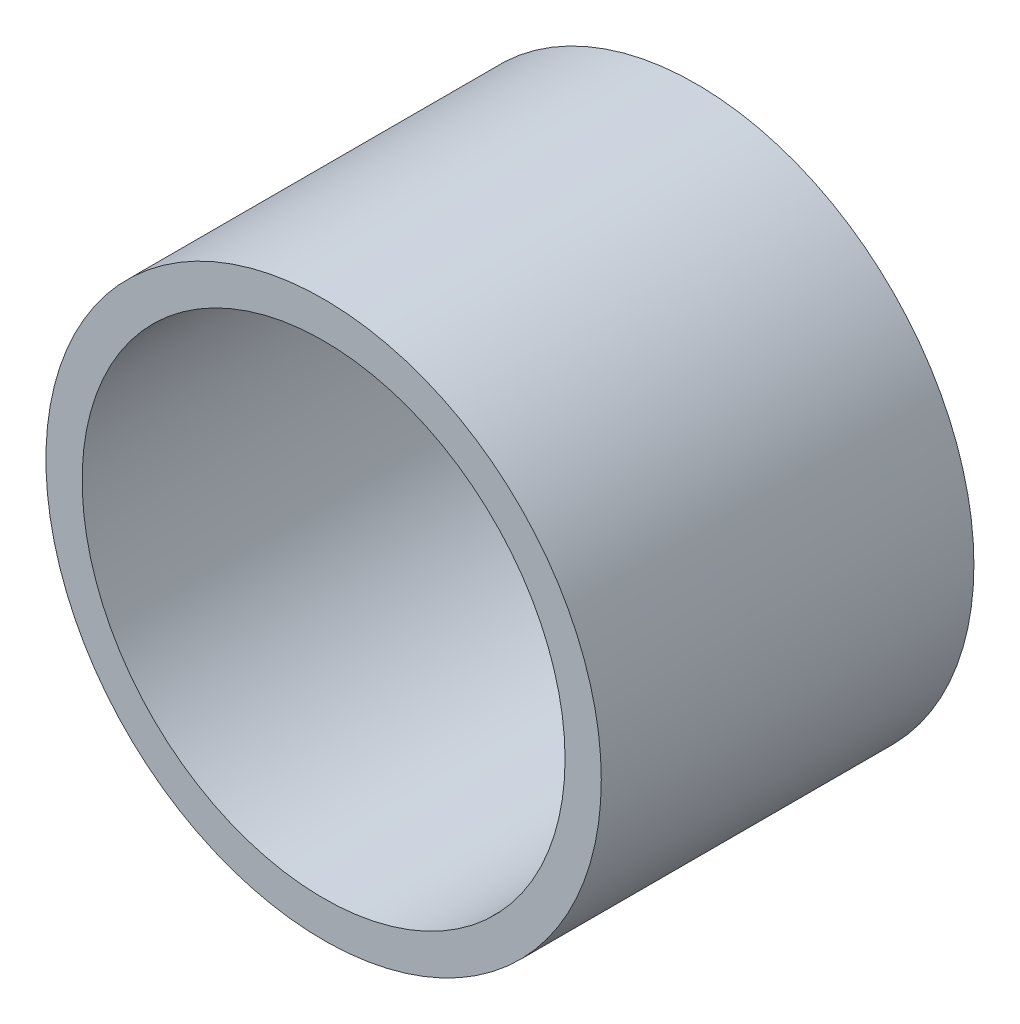
ISO-10303-21;
HEADER;
FILE_DESCRIPTION(('STEP AP214'),'2;1');
FILE_NAME('part.step','',(''),(''),'','','');
FILE_SCHEMA(('AUTOMOTIVE_DESIGN { 1 0 10303 214 1 1 1 1 }'));
ENDSEC;
DATA;
#1=APPLICATION_CONTEXT('core data for automotive mechanical design processes');
#2=APPLICATION_PROTOCOL_DEFINITION('international standard','automotive_design',2000,#1);
#3=PRODUCT_CONTEXT('',#1,'mechanical');
#4=PRODUCT('Part','Part','',(#3));
#5=PRODUCT_RELATED_PRODUCT_CATEGORY('part','',(#4));
#6=PRODUCT_DEFINITION_FORMATION('','',#4);
#7=PRODUCT_DEFINITION_CONTEXT('part definition',#1,'design');
#8=PRODUCT_DEFINITION('design','',#6,#7);
#9=PRODUCT_DEFINITION_SHAPE('','',#8);
#10=(LENGTH_UNIT() NAMED_UNIT(*) SI_UNIT(.MILLI.,.METRE.));
#11=(NAMED_UNIT(*) PLANE_ANGLE_UNIT() SI_UNIT($,.RADIAN.));
#12=(NAMED_UNIT(*) SI_UNIT($,.STERADIAN.) SOLID_ANGLE_UNIT());
#13=UNCERTAINTY_MEASURE_WITH_UNIT(LENGTH_MEASURE(1.E-05),#10,'distance_accuracy_value','');
#14=(GEOMETRIC_REPRESENTATION_CONTEXT(3) GLOBAL_UNCERTAINTY_ASSIGNED_CONTEXT((#13)) GLOBAL_UNIT_ASSIGNED_CONTEXT((#10,
#11,#12)) REPRESENTATION_CONTEXT('',''));
#15=CARTESIAN_POINT('',(0.,0.,0.));
#16=DIRECTION('',(0.,0.,1.));
#17=DIRECTION('',(1.,0.,0.));
#18=AXIS2_PLACEMENT_3D('',#15,#16,#17);
#19=CARTESIAN_POINT('',(0.,0.,67.9));
#20=DIRECTION('',(0.,0.,1.));
#21=DIRECTION('',(1.,0.,0.));
#22=AXIS2_PLACEMENT_3D('',#19,#20,#21);
#23=PLANE('',#22);
#24=CARTESIAN_POINT('',(0.,0.,67.9));
#25=DIRECTION('',(0.,0.,1.));
#26=DIRECTION('',(1.,0.,0.));
#27=AXIS2_PLACEMENT_3D('',#24,#25,#26);
#28=CIRCLE('',#27,50.6);
#29=CARTESIAN_POINT('',(50.6,0.,67.9));
#30=VERTEX_POINT('',#29);
#31=EDGE_CURVE('E10',#30,#30,#28,.T.);
#32=ORIENTED_EDGE('',*,*,#31,.T.);
#33=EDGE_LOOP('',(#32));
#34=FACE_BOUND('',#33,.T.);
#35=CARTESIAN_POINT('',(0.,0.,67.9));
#36=DIRECTION('',(0.,0.,1.));
#37=DIRECTION('',(1.,0.,0.));
#38=AXIS2_PLACEMENT_3D('',#35,#36,#37);
#39=CIRCLE('',#38,44.);
#40=CARTESIAN_POINT('',(44.,0.,67.9));
#41=VERTEX_POINT('',#40);
#42=EDGE_CURVE('E42',#41,#41,#39,.T.);
#43=ORIENTED_EDGE('',*,*,#42,.F.);
#44=EDGE_LOOP('',(#43));
#45=FACE_BOUND('',#44,.T.);
#46=ADVANCED_FACE('F31',(#34,#45),#23,.T.);
#47=CARTESIAN_POINT('',(0.,0.,0.));
#48=DIRECTION('',(0.,0.,1.));
#49=DIRECTION('',(1.,0.,0.));
#50=AXIS2_PLACEMENT_3D('',#47,#48,#49);
#51=PLANE('',#50);
#52=CARTESIAN_POINT('',(0.,0.,0.));
#53=DIRECTION('',(0.,0.,1.));
#54=DIRECTION('',(1.,0.,0.));
#55=AXIS2_PLACEMENT_3D('',#52,#53,#54);
#56=CIRCLE('',#55,50.6);
#57=CARTESIAN_POINT('',(50.6,0.,0.));
#58=VERTEX_POINT('',#57);
#59=EDGE_CURVE('E35',#58,#58,#56,.T.);
#60=ORIENTED_EDGE('',*,*,#59,.F.);
#61=EDGE_LOOP('',(#60));
#62=FACE_BOUND('',#61,.T.);
#63=CARTESIAN_POINT('',(0.,0.,0.));
#64=DIRECTION('',(0.,0.,1.));
#65=DIRECTION('',(1.,0.,0.));
#66=AXIS2_PLACEMENT_3D('',#63,#64,#65);
#67=CIRCLE('',#66,44.);
#68=CARTESIAN_POINT('',(44.,0.,0.));
#69=VERTEX_POINT('',#68);
#70=EDGE_CURVE('E44',#69,#69,#67,.T.);
#71=ORIENTED_EDGE('',*,*,#70,.T.);
#72=EDGE_LOOP('',(#71));
#73=FACE_BOUND('',#72,.T.);
#74=ADVANCED_FACE('F54',(#62,#73),#51,.F.);
#75=CARTESIAN_POINT('',(0.,0.,67.9));
#76=DIRECTION('',(0.,0.,-1.));
#77=DIRECTION('',(-1.,0.,0.));
#78=AXIS2_PLACEMENT_3D('',#75,#76,#77);
#79=CYLINDRICAL_SURFACE('',#78,50.6);
#80=ORIENTED_EDGE('',*,*,#31,.F.);
#81=EDGE_LOOP('',(#80));
#82=FACE_BOUND('',#81,.T.);
#83=ORIENTED_EDGE('',*,*,#59,.T.);
#84=EDGE_LOOP('',(#83));
#85=FACE_BOUND('',#84,.T.);
#86=ADVANCED_FACE('F33',(#82,#85),#79,.T.);
#87=CARTESIAN_POINT('',(0.,0.,67.9));
#88=DIRECTION('',(0.,0.,-1.));
#89=DIRECTION('',(-1.,0.,0.));
#90=AXIS2_PLACEMENT_3D('',#87,#88,#89);
#91=CYLINDRICAL_SURFACE('',#90,44.);
#92=ORIENTED_EDGE('',*,*,#42,.T.);
#93=EDGE_LOOP('',(#92));
#94=FACE_BOUND('',#93,.T.);
#95=ORIENTED_EDGE('',*,*,#70,.F.);
#96=EDGE_LOOP('',(#95));
#97=FACE_BOUND('',#96,.T.);
#98=ADVANCED_FACE('F50',(#94,#97),#91,.F.);
#99=CLOSED_SHELL('',(#46,#74,#86,#98));
#100=MANIFOLD_SOLID_BREP('B2',#99);
#101=ADVANCED_BREP_SHAPE_REPRESENTATION('',(#18,#100),#14);
#102=SHAPE_DEFINITION_REPRESENTATION(#9,#101);
ENDSEC;
END-ISO-10303-21;
